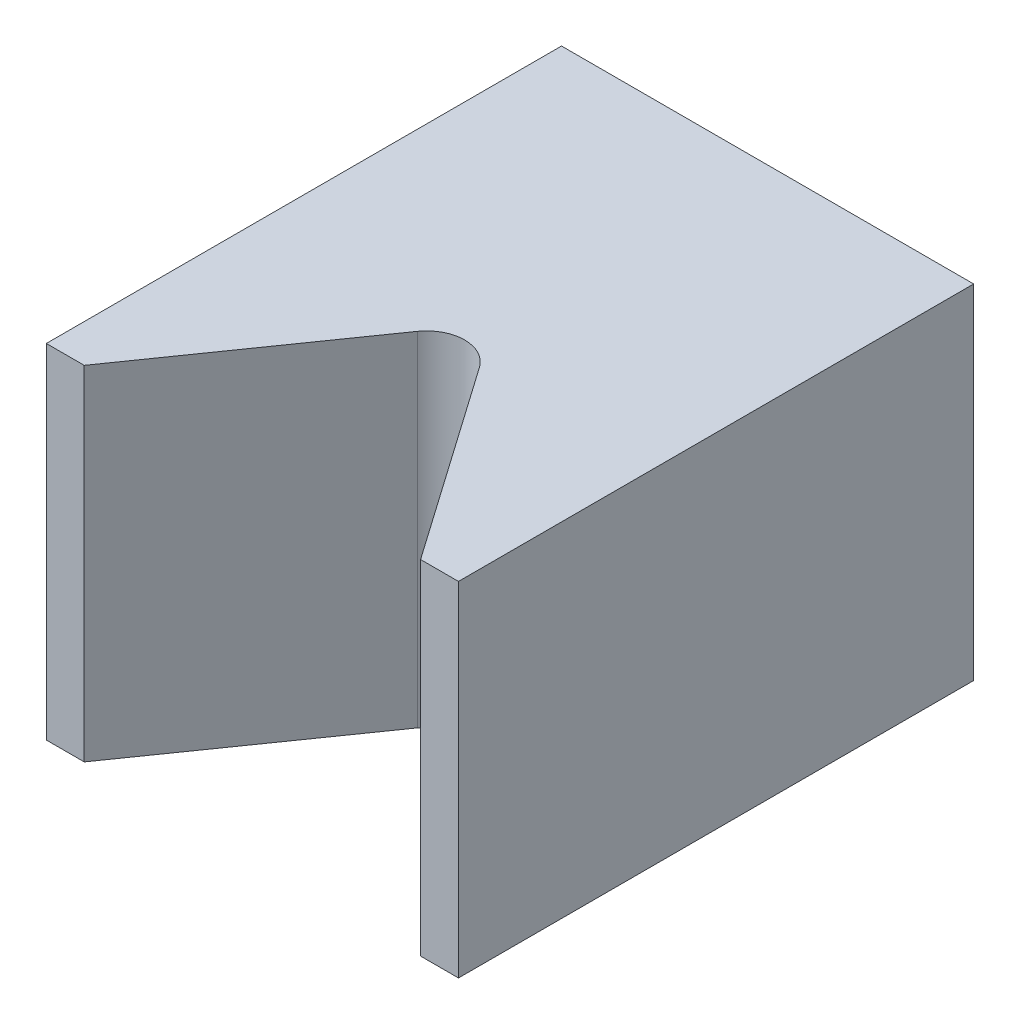
ISO-10303-21;
HEADER;
FILE_DESCRIPTION(('STEP AP214'),'2;1');
FILE_NAME('part.step','',(''),(''),'','','');
FILE_SCHEMA(('AUTOMOTIVE_DESIGN { 1 0 10303 214 1 1 1 1 }'));
ENDSEC;
DATA;
#1=APPLICATION_CONTEXT('core data for automotive mechanical design processes');
#2=APPLICATION_PROTOCOL_DEFINITION('international standard','automotive_design',2000,#1);
#3=PRODUCT_CONTEXT('',#1,'mechanical');
#4=PRODUCT('Part','Part','',(#3));
#5=PRODUCT_RELATED_PRODUCT_CATEGORY('part','',(#4));
#6=PRODUCT_DEFINITION_FORMATION('','',#4);
#7=PRODUCT_DEFINITION_CONTEXT('part definition',#1,'design');
#8=PRODUCT_DEFINITION('design','',#6,#7);
#9=PRODUCT_DEFINITION_SHAPE('','',#8);
#10=(LENGTH_UNIT() NAMED_UNIT(*) SI_UNIT(.MILLI.,.METRE.));
#11=(NAMED_UNIT(*) PLANE_ANGLE_UNIT() SI_UNIT($,.RADIAN.));
#12=(NAMED_UNIT(*) SI_UNIT($,.STERADIAN.) SOLID_ANGLE_UNIT());
#13=UNCERTAINTY_MEASURE_WITH_UNIT(LENGTH_MEASURE(1.E-05),#10,'distance_accuracy_value','');
#14=(GEOMETRIC_REPRESENTATION_CONTEXT(3) GLOBAL_UNCERTAINTY_ASSIGNED_CONTEXT((#13)) GLOBAL_UNIT_ASSIGNED_CONTEXT((#10,
#11,#12)) REPRESENTATION_CONTEXT('',''));
#15=CARTESIAN_POINT('',(0.,0.,0.));
#16=DIRECTION('',(0.,0.,1.));
#17=DIRECTION('',(1.,0.,0.));
#18=AXIS2_PLACEMENT_3D('',#15,#16,#17);
#19=CARTESIAN_POINT('',(0.,10.,0.));
#20=DIRECTION('',(0.,-1.,0.));
#21=DIRECTION('',(0.,0.,-1.));
#22=AXIS2_PLACEMENT_3D('',#19,#20,#21);
#23=CYLINDRICAL_SURFACE('',#22,1.10397097473191);
#24=CARTESIAN_POINT('',(0.,0.,0.));
#25=DIRECTION('',(0.,-1.,0.));
#26=DIRECTION('',(0.,0.,1.));
#27=AXIS2_PLACEMENT_3D('',#24,#25,#26);
#28=CIRCLE('',#27,1.10397097473191);
#29=CARTESIAN_POINT('',(-0.904649292853459,0.,-0.63274131364267));
#30=VERTEX_POINT('',#29);
#31=CARTESIAN_POINT('',(0.90464929285346,0.,-0.63274131364267));
#32=VERTEX_POINT('',#31);
#33=EDGE_CURVE('E146',#30,#32,#28,.T.);
#34=ORIENTED_EDGE('',*,*,#33,.T.);
#35=DIRECTION('',(0.,-1.,0.));
#36=VECTOR('',#35,1.);
#37=CARTESIAN_POINT('',(0.90464929285346,10.,-0.63274131364267));
#38=LINE('',#37,#36);
#39=CARTESIAN_POINT('',(0.90464929285346,10.,-0.63274131364267));
#40=VERTEX_POINT('',#39);
#41=EDGE_CURVE('E11',#40,#32,#38,.T.);
#42=ORIENTED_EDGE('',*,*,#41,.F.);
#43=CARTESIAN_POINT('',(0.,10.,0.));
#44=DIRECTION('',(0.,-1.,0.));
#45=DIRECTION('',(0.,0.,1.));
#46=AXIS2_PLACEMENT_3D('',#43,#44,#45);
#47=CIRCLE('',#46,1.10397097473191);
#48=CARTESIAN_POINT('',(-0.904649292853459,10.,-0.63274131364267));
#49=VERTEX_POINT('',#48);
#50=EDGE_CURVE('E169',#49,#40,#47,.T.);
#51=ORIENTED_EDGE('',*,*,#50,.F.);
#52=DIRECTION('',(0.,-1.,0.));
#53=VECTOR('',#52,1.);
#54=CARTESIAN_POINT('',(-0.904649292853459,10.,-0.63274131364267));
#55=LINE('',#54,#53);
#56=EDGE_CURVE('E142',#49,#30,#55,.T.);
#57=ORIENTED_EDGE('',*,*,#56,.T.);
#58=EDGE_LOOP('',(#34,#42,#51,#57));
#59=FACE_BOUND('',#58,.T.);
#60=ADVANCED_FACE('F45',(#59),#23,.F.);
#61=CARTESIAN_POINT('',(0.90464929285346,10.,-0.63274131364267));
#62=DIRECTION('',(0.819450251464394,0.,-0.573150316561844));
#63=DIRECTION('',(-0.573150316561844,0.,-0.819450251464394));
#64=AXIS2_PLACEMENT_3D('',#61,#62,#63);
#65=PLANE('',#64);
#66=DIRECTION('',(0.573150316561844,0.,0.819450251464394));
#67=VECTOR('',#66,1.);
#68=CARTESIAN_POINT('',(0.90464929285346,0.,-0.63274131364267));
#69=LINE('',#68,#67);
#70=CARTESIAN_POINT('',(4.89602902526809,0.,5.07385437496694));
#71=VERTEX_POINT('',#70);
#72=EDGE_CURVE('E150',#32,#71,#69,.T.);
#73=ORIENTED_EDGE('',*,*,#72,.T.);
#74=DIRECTION('',(0.,-1.,0.));
#75=VECTOR('',#74,1.);
#76=CARTESIAN_POINT('',(4.89602902526809,10.,5.07385437496694));
#77=LINE('',#76,#75);
#78=CARTESIAN_POINT('',(4.89602902526809,10.,5.07385437496694));
#79=VERTEX_POINT('',#78);
#80=EDGE_CURVE('E54',#79,#71,#77,.T.);
#81=ORIENTED_EDGE('',*,*,#80,.F.);
#82=DIRECTION('',(0.573150316561844,0.,0.819450251464394));
#83=VECTOR('',#82,1.);
#84=CARTESIAN_POINT('',(0.90464929285346,10.,-0.63274131364267));
#85=LINE('',#84,#83);
#86=EDGE_CURVE('E105',#40,#79,#85,.T.);
#87=ORIENTED_EDGE('',*,*,#86,.F.);
#88=ORIENTED_EDGE('',*,*,#41,.T.);
#89=EDGE_LOOP('',(#73,#81,#87,#88));
#90=FACE_BOUND('',#89,.T.);
#91=ADVANCED_FACE('F239',(#90),#65,.F.);
#92=CARTESIAN_POINT('',(4.89602902526809,10.,5.07385437496694));
#93=DIRECTION('',(0.,0.,-1.));
#94=DIRECTION('',(-1.,0.,0.));
#95=AXIS2_PLACEMENT_3D('',#92,#93,#94);
#96=PLANE('',#95);
#97=DIRECTION('',(1.,0.,0.));
#98=VECTOR('',#97,1.);
#99=CARTESIAN_POINT('',(4.89602902526809,0.,5.07385437496694));
#100=LINE('',#99,#98);
#101=CARTESIAN_POINT('',(6.,0.,5.07385437496694));
#102=VERTEX_POINT('',#101);
#103=EDGE_CURVE('E154',#71,#102,#100,.T.);
#104=ORIENTED_EDGE('',*,*,#103,.T.);
#105=DIRECTION('',(0.,-1.,0.));
#106=VECTOR('',#105,1.);
#107=CARTESIAN_POINT('',(6.,10.,5.07385437496694));
#108=LINE('',#107,#106);
#109=CARTESIAN_POINT('',(6.,10.,5.07385437496694));
#110=VERTEX_POINT('',#109);
#111=EDGE_CURVE('E180',#110,#102,#108,.T.);
#112=ORIENTED_EDGE('',*,*,#111,.F.);
#113=DIRECTION('',(1.,0.,0.));
#114=VECTOR('',#113,1.);
#115=CARTESIAN_POINT('',(4.89602902526809,10.,5.07385437496694));
#116=LINE('',#115,#114);
#117=EDGE_CURVE('E190',#79,#110,#116,.T.);
#118=ORIENTED_EDGE('',*,*,#117,.F.);
#119=ORIENTED_EDGE('',*,*,#80,.T.);
#120=EDGE_LOOP('',(#104,#112,#118,#119));
#121=FACE_BOUND('',#120,.T.);
#122=ADVANCED_FACE('F188',(#121),#96,.F.);
#123=CARTESIAN_POINT('',(6.,10.,5.07385437496694));
#124=DIRECTION('',(-1.,0.,0.));
#125=DIRECTION('',(0.,0.,1.));
#126=AXIS2_PLACEMENT_3D('',#123,#124,#125);
#127=PLANE('',#126);
#128=DIRECTION('',(0.,0.,-1.));
#129=VECTOR('',#128,1.);
#130=CARTESIAN_POINT('',(6.,0.,5.07385437496694));
#131=LINE('',#130,#129);
#132=CARTESIAN_POINT('',(6.,0.,-9.92614562503306));
#133=VERTEX_POINT('',#132);
#134=EDGE_CURVE('E157',#102,#133,#131,.T.);
#135=ORIENTED_EDGE('',*,*,#134,.T.);
#136=DIRECTION('',(0.,-1.,0.));
#137=VECTOR('',#136,1.);
#138=CARTESIAN_POINT('',(6.,10.,-9.92614562503306));
#139=LINE('',#138,#137);
#140=CARTESIAN_POINT('',(6.,10.,-9.92614562503306));
#141=VERTEX_POINT('',#140);
#142=EDGE_CURVE('E176',#141,#133,#139,.T.);
#143=ORIENTED_EDGE('',*,*,#142,.F.);
#144=DIRECTION('',(0.,0.,-1.));
#145=VECTOR('',#144,1.);
#146=CARTESIAN_POINT('',(6.,10.,5.07385437496694));
#147=LINE('',#146,#145);
#148=EDGE_CURVE('E203',#110,#141,#147,.T.);
#149=ORIENTED_EDGE('',*,*,#148,.F.);
#150=ORIENTED_EDGE('',*,*,#111,.T.);
#151=EDGE_LOOP('',(#135,#143,#149,#150));
#152=FACE_BOUND('',#151,.T.);
#153=ADVANCED_FACE('F198',(#152),#127,.F.);
#154=CARTESIAN_POINT('',(6.,10.,-9.92614562503306));
#155=DIRECTION('',(0.,0.,1.));
#156=DIRECTION('',(1.,0.,0.));
#157=AXIS2_PLACEMENT_3D('',#154,#155,#156);
#158=PLANE('',#157);
#159=CARTESIAN_POINT('',(0.,5.,-9.92614562503306));
#160=DIRECTION('',(0.,0.,-1.));
#161=DIRECTION('',(-1.,0.,0.));
#162=AXIS2_PLACEMENT_3D('',#159,#160,#161);
#163=CIRCLE('',#162,2.1);
#164=CARTESIAN_POINT('',(-2.1,5.,-9.92614562503306));
#165=VERTEX_POINT('',#164);
#166=EDGE_CURVE('E213',#165,#165,#163,.T.);
#167=ORIENTED_EDGE('',*,*,#166,.F.);
#168=EDGE_LOOP('',(#167));
#169=FACE_BOUND('',#168,.T.);
#170=DIRECTION('',(-1.,0.,0.));
#171=VECTOR('',#170,1.);
#172=CARTESIAN_POINT('',(6.,0.,-9.92614562503306));
#173=LINE('',#172,#171);
#174=CARTESIAN_POINT('',(-6.,0.,-9.92614562503305));
#175=VERTEX_POINT('',#174);
#176=EDGE_CURVE('E160',#133,#175,#173,.T.);
#177=ORIENTED_EDGE('',*,*,#176,.T.);
#178=DIRECTION('',(0.,-1.,0.));
#179=VECTOR('',#178,1.);
#180=CARTESIAN_POINT('',(-6.,10.,-9.92614562503305));
#181=LINE('',#180,#179);
#182=CARTESIAN_POINT('',(-6.,10.,-9.92614562503305));
#183=VERTEX_POINT('',#182);
#184=EDGE_CURVE('E135',#183,#175,#181,.T.);
#185=ORIENTED_EDGE('',*,*,#184,.F.);
#186=DIRECTION('',(-1.,0.,0.));
#187=VECTOR('',#186,1.);
#188=CARTESIAN_POINT('',(6.,10.,-9.92614562503306));
#189=LINE('',#188,#187);
#190=EDGE_CURVE('E124',#141,#183,#189,.T.);
#191=ORIENTED_EDGE('',*,*,#190,.F.);
#192=ORIENTED_EDGE('',*,*,#142,.T.);
#193=EDGE_LOOP('',(#177,#185,#191,#192));
#194=FACE_BOUND('',#193,.T.);
#195=ADVANCED_FACE('F201',(#169,#194),#158,.F.);
#196=CARTESIAN_POINT('',(-6.,10.,-9.92614562503305));
#197=DIRECTION('',(1.,0.,0.));
#198=DIRECTION('',(0.,0.,-1.));
#199=AXIS2_PLACEMENT_3D('',#196,#197,#198);
#200=PLANE('',#199);
#201=DIRECTION('',(0.,0.,1.));
#202=VECTOR('',#201,1.);
#203=CARTESIAN_POINT('',(-6.,0.,-9.92614562503305));
#204=LINE('',#203,#202);
#205=CARTESIAN_POINT('',(-6.,0.,5.07385437496694));
#206=VERTEX_POINT('',#205);
#207=EDGE_CURVE('E133',#175,#206,#204,.T.);
#208=ORIENTED_EDGE('',*,*,#207,.T.);
#209=DIRECTION('',(0.,-1.,0.));
#210=VECTOR('',#209,1.);
#211=CARTESIAN_POINT('',(-6.,10.,5.07385437496694));
#212=LINE('',#211,#210);
#213=CARTESIAN_POINT('',(-6.,10.,5.07385437496694));
#214=VERTEX_POINT('',#213);
#215=EDGE_CURVE('E130',#214,#206,#212,.T.);
#216=ORIENTED_EDGE('',*,*,#215,.F.);
#217=DIRECTION('',(0.,0.,1.));
#218=VECTOR('',#217,1.);
#219=CARTESIAN_POINT('',(-6.,10.,-9.92614562503305));
#220=LINE('',#219,#218);
#221=EDGE_CURVE('E118',#183,#214,#220,.T.);
#222=ORIENTED_EDGE('',*,*,#221,.F.);
#223=ORIENTED_EDGE('',*,*,#184,.T.);
#224=EDGE_LOOP('',(#208,#216,#222,#223));
#225=FACE_BOUND('',#224,.T.);
#226=ADVANCED_FACE('F131',(#225),#200,.F.);
#227=CARTESIAN_POINT('',(-6.,10.,5.07385437496694));
#228=DIRECTION('',(0.,0.,-1.));
#229=DIRECTION('',(-1.,0.,0.));
#230=AXIS2_PLACEMENT_3D('',#227,#228,#229);
#231=PLANE('',#230);
#232=DIRECTION('',(1.,0.,0.));
#233=VECTOR('',#232,1.);
#234=CARTESIAN_POINT('',(-6.,0.,5.07385437496694));
#235=LINE('',#234,#233);
#236=CARTESIAN_POINT('',(-4.89602902526809,0.,5.07385437496694));
#237=VERTEX_POINT('',#236);
#238=EDGE_CURVE('E91',#206,#237,#235,.T.);
#239=ORIENTED_EDGE('',*,*,#238,.T.);
#240=DIRECTION('',(0.,-1.,0.));
#241=VECTOR('',#240,1.);
#242=CARTESIAN_POINT('',(-4.89602902526809,10.,5.07385437496694));
#243=LINE('',#242,#241);
#244=CARTESIAN_POINT('',(-4.89602902526809,10.,5.07385437496694));
#245=VERTEX_POINT('',#244);
#246=EDGE_CURVE('E136',#245,#237,#243,.T.);
#247=ORIENTED_EDGE('',*,*,#246,.F.);
#248=DIRECTION('',(1.,0.,0.));
#249=VECTOR('',#248,1.);
#250=CARTESIAN_POINT('',(-6.,10.,5.07385437496694));
#251=LINE('',#250,#249);
#252=EDGE_CURVE('E122',#214,#245,#251,.T.);
#253=ORIENTED_EDGE('',*,*,#252,.F.);
#254=ORIENTED_EDGE('',*,*,#215,.T.);
#255=EDGE_LOOP('',(#239,#247,#253,#254));
#256=FACE_BOUND('',#255,.T.);
#257=ADVANCED_FACE('F138',(#256),#231,.F.);
#258=CARTESIAN_POINT('',(-4.89602902526809,10.,5.07385437496694));
#259=DIRECTION('',(-0.819450251464394,0.,-0.573150316561844));
#260=DIRECTION('',(-0.573150316561844,0.,0.819450251464394));
#261=AXIS2_PLACEMENT_3D('',#258,#259,#260);
#262=PLANE('',#261);
#263=DIRECTION('',(0.573150316561844,0.,-0.819450251464394));
#264=VECTOR('',#263,1.);
#265=CARTESIAN_POINT('',(-4.89602902526809,0.,5.07385437496694));
#266=LINE('',#265,#264);
#267=EDGE_CURVE('E97',#237,#30,#266,.T.);
#268=ORIENTED_EDGE('',*,*,#267,.T.);
#269=ORIENTED_EDGE('',*,*,#56,.F.);
#270=DIRECTION('',(0.573150316561844,0.,-0.819450251464394));
#271=VECTOR('',#270,1.);
#272=CARTESIAN_POINT('',(-4.89602902526809,10.,5.07385437496694));
#273=LINE('',#272,#271);
#274=EDGE_CURVE('E62',#245,#49,#273,.T.);
#275=ORIENTED_EDGE('',*,*,#274,.F.);
#276=ORIENTED_EDGE('',*,*,#246,.T.);
#277=EDGE_LOOP('',(#268,#269,#275,#276));
#278=FACE_BOUND('',#277,.T.);
#279=ADVANCED_FACE('F246',(#278),#262,.F.);
#280=CARTESIAN_POINT('',(0.,10.,0.));
#281=DIRECTION('',(0.,1.,0.));
#282=DIRECTION('',(0.,0.,1.));
#283=AXIS2_PLACEMENT_3D('',#280,#281,#282);
#284=PLANE('',#283);
#285=ORIENTED_EDGE('',*,*,#50,.T.);
#286=ORIENTED_EDGE('',*,*,#86,.T.);
#287=ORIENTED_EDGE('',*,*,#117,.T.);
#288=ORIENTED_EDGE('',*,*,#148,.T.);
#289=ORIENTED_EDGE('',*,*,#190,.T.);
#290=ORIENTED_EDGE('',*,*,#221,.T.);
#291=ORIENTED_EDGE('',*,*,#252,.T.);
#292=ORIENTED_EDGE('',*,*,#274,.T.);
#293=EDGE_LOOP('',(#285,#286,#287,#288,#289,#290,#291,#292));
#294=FACE_BOUND('',#293,.T.);
#295=ADVANCED_FACE('F120',(#294),#284,.T.);
#296=CARTESIAN_POINT('',(0.,0.,0.));
#297=DIRECTION('',(0.,1.,0.));
#298=DIRECTION('',(0.,0.,1.));
#299=AXIS2_PLACEMENT_3D('',#296,#297,#298);
#300=PLANE('',#299);
#301=ORIENTED_EDGE('',*,*,#33,.F.);
#302=ORIENTED_EDGE('',*,*,#267,.F.);
#303=ORIENTED_EDGE('',*,*,#238,.F.);
#304=ORIENTED_EDGE('',*,*,#207,.F.);
#305=ORIENTED_EDGE('',*,*,#176,.F.);
#306=ORIENTED_EDGE('',*,*,#134,.F.);
#307=ORIENTED_EDGE('',*,*,#103,.F.);
#308=ORIENTED_EDGE('',*,*,#72,.F.);
#309=EDGE_LOOP('',(#301,#302,#303,#304,#305,#306,#307,#308));
#310=FACE_BOUND('',#309,.T.);
#311=ADVANCED_FACE('F194',(#310),#300,.F.);
#312=CARTESIAN_POINT('',(0.,5.,-2.92614562503306));
#313=DIRECTION('',(0.,0.,-1.));
#314=DIRECTION('',(-1.,0.,0.));
#315=AXIS2_PLACEMENT_3D('',#312,#313,#314);
#316=CYLINDRICAL_SURFACE('',#315,2.1);
#317=CARTESIAN_POINT('',(0.,5.,-2.92614562503306));
#318=DIRECTION('',(0.,0.,-1.));
#319=DIRECTION('',(-1.,0.,0.));
#320=AXIS2_PLACEMENT_3D('',#317,#318,#319);
#321=CIRCLE('',#320,2.1);
#322=CARTESIAN_POINT('',(-2.10000000000001,5.,-2.92614562503306));
#323=VERTEX_POINT('',#322);
#324=EDGE_CURVE('E151',#323,#323,#321,.T.);
#325=ORIENTED_EDGE('',*,*,#324,.F.);
#326=EDGE_LOOP('',(#325));
#327=FACE_BOUND('',#326,.T.);
#328=ORIENTED_EDGE('',*,*,#166,.T.);
#329=EDGE_LOOP('',(#328));
#330=FACE_BOUND('',#329,.T.);
#331=ADVANCED_FACE('F223',(#327,#330),#316,.F.);
#332=CARTESIAN_POINT('',(0.,0.,-2.92614562503306));
#333=DIRECTION('',(0.,0.,-1.));
#334=DIRECTION('',(-1.,0.,0.));
#335=AXIS2_PLACEMENT_3D('',#332,#333,#334);
#336=PLANE('',#335);
#337=ORIENTED_EDGE('',*,*,#324,.T.);
#338=EDGE_LOOP('',(#337));
#339=FACE_BOUND('',#338,.T.);
#340=ADVANCED_FACE('F221',(#339),#336,.T.);
#341=CLOSED_SHELL('',(#60,#91,#122,#153,#195,#226,#257,#279,#295,#311,#331,#340));
#342=MANIFOLD_SOLID_BREP('B2',#341);
#343=ADVANCED_BREP_SHAPE_REPRESENTATION('',(#18,#342),#14);
#344=SHAPE_DEFINITION_REPRESENTATION(#9,#343);
ENDSEC;
END-ISO-10303-21;
